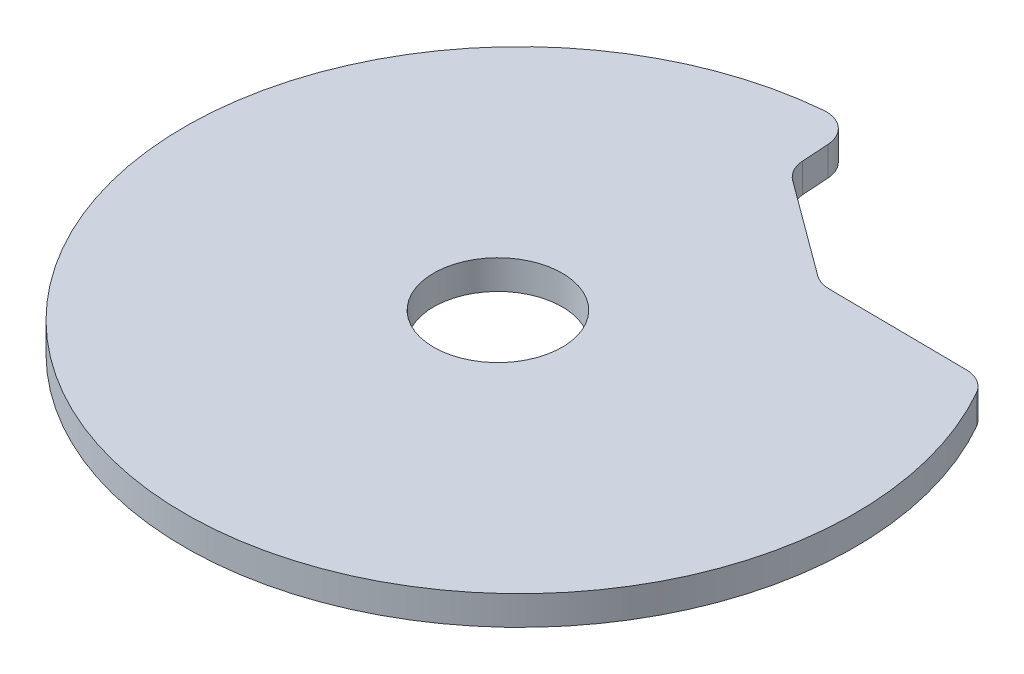
ISO-10303-21;
HEADER;
FILE_DESCRIPTION(('STEP AP214'),'2;1');
FILE_NAME('part.step','',(''),(''),'','','');
FILE_SCHEMA(('AUTOMOTIVE_DESIGN { 1 0 10303 214 1 1 1 1 }'));
ENDSEC;
DATA;
#1=APPLICATION_CONTEXT('core data for automotive mechanical design processes');
#2=APPLICATION_PROTOCOL_DEFINITION('international standard','automotive_design',2000,#1);
#3=PRODUCT_CONTEXT('',#1,'mechanical');
#4=PRODUCT('Part','Part','',(#3));
#5=PRODUCT_RELATED_PRODUCT_CATEGORY('part','',(#4));
#6=PRODUCT_DEFINITION_FORMATION('','',#4);
#7=PRODUCT_DEFINITION_CONTEXT('part definition',#1,'design');
#8=PRODUCT_DEFINITION('design','',#6,#7);
#9=PRODUCT_DEFINITION_SHAPE('','',#8);
#10=(LENGTH_UNIT() NAMED_UNIT(*) SI_UNIT(.MILLI.,.METRE.));
#11=(NAMED_UNIT(*) PLANE_ANGLE_UNIT() SI_UNIT($,.RADIAN.));
#12=(NAMED_UNIT(*) SI_UNIT($,.STERADIAN.) SOLID_ANGLE_UNIT());
#13=UNCERTAINTY_MEASURE_WITH_UNIT(LENGTH_MEASURE(1.E-05),#10,'distance_accuracy_value','');
#14=(GEOMETRIC_REPRESENTATION_CONTEXT(3) GLOBAL_UNCERTAINTY_ASSIGNED_CONTEXT((#13)) GLOBAL_UNIT_ASSIGNED_CONTEXT((#10,
#11,#12)) REPRESENTATION_CONTEXT('',''));
#15=CARTESIAN_POINT('',(0.,0.,0.));
#16=DIRECTION('',(0.,0.,1.));
#17=DIRECTION('',(1.,0.,0.));
#18=AXIS2_PLACEMENT_3D('',#15,#16,#17);
#19=CARTESIAN_POINT('',(110.644760689443,5.,15.7057957737216));
#20=DIRECTION('',(0.,-1.,0.));
#21=DIRECTION('',(0.,0.,-1.));
#22=AXIS2_PLACEMENT_3D('',#19,#20,#21);
#23=CYLINDRICAL_SURFACE('',#22,5.);
#24=CARTESIAN_POINT('',(110.644760689443,0.,15.7057957737216));
#25=DIRECTION('',(0.,1.,0.));
#26=DIRECTION('',(0.,0.,-1.));
#27=AXIS2_PLACEMENT_3D('',#24,#25,#26);
#28=CIRCLE('',#27,5.);
#29=CARTESIAN_POINT('',(114.991586449579,0.,13.2349445416514));
#30=VERTEX_POINT('',#29);
#31=CARTESIAN_POINT('',(110.693591380557,0.,10.7060342230468));
#32=VERTEX_POINT('',#31);
#33=EDGE_CURVE('E127',#30,#32,#28,.T.);
#34=ORIENTED_EDGE('',*,*,#33,.T.);
#35=DIRECTION('',(0.,-1.,0.));
#36=VECTOR('',#35,1.);
#37=CARTESIAN_POINT('',(110.693591380557,5.,10.7060342230468));
#38=LINE('',#37,#36);
#39=CARTESIAN_POINT('',(110.693591380557,5.,10.7060342230468));
#40=VERTEX_POINT('',#39);
#41=EDGE_CURVE('E11',#40,#32,#38,.T.);
#42=ORIENTED_EDGE('',*,*,#41,.F.);
#43=CARTESIAN_POINT('',(110.644760689443,5.,15.7057957737216));
#44=DIRECTION('',(0.,1.,0.));
#45=DIRECTION('',(0.,0.,-1.));
#46=AXIS2_PLACEMENT_3D('',#43,#44,#45);
#47=CIRCLE('',#46,5.);
#48=CARTESIAN_POINT('',(114.991586449579,5.,13.2349445416514));
#49=VERTEX_POINT('',#48);
#50=EDGE_CURVE('E142',#49,#40,#47,.T.);
#51=ORIENTED_EDGE('',*,*,#50,.F.);
#52=DIRECTION('',(0.,-1.,0.));
#53=VECTOR('',#52,1.);
#54=CARTESIAN_POINT('',(114.991586449579,5.,13.2349445416514));
#55=LINE('',#54,#53);
#56=EDGE_CURVE('E123',#49,#30,#55,.T.);
#57=ORIENTED_EDGE('',*,*,#56,.T.);
#58=EDGE_LOOP('',(#34,#42,#51,#57));
#59=FACE_BOUND('',#58,.T.);
#60=ADVANCED_FACE('F31',(#59),#23,.T.);
#61=CARTESIAN_POINT('',(110.693591380557,5.,10.7060342230468));
#62=DIRECTION('',(-0.00976613822282927,0.,0.999952310134945));
#63=DIRECTION('',(0.999952310134945,0.,0.00976613822282927));
#64=AXIS2_PLACEMENT_3D('',#61,#62,#63);
#65=PLANE('',#64);
#66=DIRECTION('',(-0.999952310134945,0.,-0.00976613822282927));
#67=VECTOR('',#66,1.);
#68=CARTESIAN_POINT('',(110.693591380557,0.,10.7060342230468));
#69=LINE('',#68,#67);
#70=CARTESIAN_POINT('',(86.9871071481649,0.,10.4745023795336));
#71=VERTEX_POINT('',#70);
#72=EDGE_CURVE('E130',#32,#71,#69,.T.);
#73=ORIENTED_EDGE('',*,*,#72,.T.);
#74=DIRECTION('',(0.,-1.,0.));
#75=VECTOR('',#74,1.);
#76=CARTESIAN_POINT('',(86.9871071481649,5.,10.4745023795336));
#77=LINE('',#76,#75);
#78=CARTESIAN_POINT('',(86.9871071481649,5.,10.4745023795336));
#79=VERTEX_POINT('',#78);
#80=EDGE_CURVE('E39',#79,#71,#77,.T.);
#81=ORIENTED_EDGE('',*,*,#80,.F.);
#82=DIRECTION('',(-0.999952310134945,0.,-0.00976613822282927));
#83=VECTOR('',#82,1.);
#84=CARTESIAN_POINT('',(110.693591380557,5.,10.7060342230468));
#85=LINE('',#84,#83);
#86=EDGE_CURVE('E90',#40,#79,#85,.T.);
#87=ORIENTED_EDGE('',*,*,#86,.F.);
#88=ORIENTED_EDGE('',*,*,#41,.T.);
#89=EDGE_LOOP('',(#73,#81,#87,#88));
#90=FACE_BOUND('',#89,.T.);
#91=ADVANCED_FACE('F198',(#90),#65,.F.);
#92=CARTESIAN_POINT('',(87.035937839279,5.,5.47474082885887));
#93=DIRECTION('',(0.,-1.,0.));
#94=DIRECTION('',(0.,0.,-1.));
#95=AXIS2_PLACEMENT_3D('',#92,#93,#94);
#96=CYLINDRICAL_SURFACE('',#95,5.);
#97=CARTESIAN_POINT('',(87.035937839279,0.,5.47474082885887));
#98=DIRECTION('',(0.,-1.,0.));
#99=DIRECTION('',(0.,0.,1.));
#100=AXIS2_PLACEMENT_3D('',#97,#98,#99);
#101=CIRCLE('',#100,5.);
#102=CARTESIAN_POINT('',(84.0715766505996,0.,9.50122350522184));
#103=VERTEX_POINT('',#102);
#104=EDGE_CURVE('E133',#71,#103,#101,.T.);
#105=ORIENTED_EDGE('',*,*,#104,.T.);
#106=DIRECTION('',(0.,-1.,0.));
#107=VECTOR('',#106,1.);
#108=CARTESIAN_POINT('',(84.0715766505996,5.,9.50122350522184));
#109=LINE('',#108,#107);
#110=CARTESIAN_POINT('',(84.0715766505996,5.,9.50122350522184));
#111=VERTEX_POINT('',#110);
#112=EDGE_CURVE('E149',#111,#103,#109,.T.);
#113=ORIENTED_EDGE('',*,*,#112,.F.);
#114=CARTESIAN_POINT('',(87.035937839279,5.,5.47474082885887));
#115=DIRECTION('',(0.,-1.,0.));
#116=DIRECTION('',(0.,0.,1.));
#117=AXIS2_PLACEMENT_3D('',#114,#115,#116);
#118=CIRCLE('',#117,5.);
#119=EDGE_CURVE('E157',#79,#111,#118,.T.);
#120=ORIENTED_EDGE('',*,*,#119,.F.);
#121=ORIENTED_EDGE('',*,*,#80,.T.);
#122=EDGE_LOOP('',(#105,#113,#120,#121));
#123=FACE_BOUND('',#122,.T.);
#124=ADVANCED_FACE('F155',(#123),#96,.F.);
#125=CARTESIAN_POINT('',(84.0715766505996,5.,9.50122350522184));
#126=DIRECTION('',(-0.592872237735882,0.,0.805296535272596));
#127=DIRECTION('',(0.805296535272596,0.,0.592872237735882));
#128=AXIS2_PLACEMENT_3D('',#125,#126,#127);
#129=PLANE('',#128);
#130=DIRECTION('',(-0.805296535272596,0.,-0.592872237735882));
#131=VECTOR('',#130,1.);
#132=CARTESIAN_POINT('',(84.0715766505996,0.,9.50122350522184));
#133=LINE('',#132,#131);
#134=CARTESIAN_POINT('',(67.7730019937291,0.,-2.498048819293));
#135=VERTEX_POINT('',#134);
#136=EDGE_CURVE('E135',#103,#135,#133,.T.);
#137=ORIENTED_EDGE('',*,*,#136,.T.);
#138=DIRECTION('',(0.,-1.,0.));
#139=VECTOR('',#138,1.);
#140=CARTESIAN_POINT('',(67.7730019937291,5.,-2.498048819293));
#141=LINE('',#140,#139);
#142=CARTESIAN_POINT('',(67.7730019937291,5.,-2.498048819293));
#143=VERTEX_POINT('',#142);
#144=EDGE_CURVE('E146',#143,#135,#141,.T.);
#145=ORIENTED_EDGE('',*,*,#144,.F.);
#146=DIRECTION('',(-0.805296535272596,0.,-0.592872237735882));
#147=VECTOR('',#146,1.);
#148=CARTESIAN_POINT('',(84.0715766505996,5.,9.50122350522184));
#149=LINE('',#148,#147);
#150=EDGE_CURVE('E169',#111,#143,#149,.T.);
#151=ORIENTED_EDGE('',*,*,#150,.F.);
#152=ORIENTED_EDGE('',*,*,#112,.T.);
#153=EDGE_LOOP('',(#137,#145,#151,#152));
#154=FACE_BOUND('',#153,.T.);
#155=ADVANCED_FACE('F165',(#154),#129,.F.);
#156=CARTESIAN_POINT('',(70.7373631824085,5.,-6.52453149565599));
#157=DIRECTION('',(0.,-1.,0.));
#158=DIRECTION('',(0.,0.,-1.));
#159=AXIS2_PLACEMENT_3D('',#156,#157,#158);
#160=CYLINDRICAL_SURFACE('',#159,5.00000000000001);
#161=CARTESIAN_POINT('',(70.7373631824085,0.,-6.52453149565599));
#162=DIRECTION('',(0.,-1.,0.));
#163=DIRECTION('',(0.,0.,1.));
#164=AXIS2_PLACEMENT_3D('',#161,#162,#163);
#165=CIRCLE('',#164,5.00000000000001);
#166=CARTESIAN_POINT('',(65.7479465901804,0.,-6.19938219272063));
#167=VERTEX_POINT('',#166);
#168=EDGE_CURVE('E137',#135,#167,#165,.T.);
#169=ORIENTED_EDGE('',*,*,#168,.T.);
#170=DIRECTION('',(0.,-1.,0.));
#171=VECTOR('',#170,1.);
#172=CARTESIAN_POINT('',(65.7479465901804,5.,-6.19938219272063));
#173=LINE('',#172,#171);
#174=CARTESIAN_POINT('',(65.7479465901804,5.,-6.19938219272063));
#175=VERTEX_POINT('',#174);
#176=EDGE_CURVE('E118',#175,#167,#173,.T.);
#177=ORIENTED_EDGE('',*,*,#176,.F.);
#178=CARTESIAN_POINT('',(70.7373631824085,5.,-6.52453149565599));
#179=DIRECTION('',(0.,-1.,0.));
#180=DIRECTION('',(0.,0.,1.));
#181=AXIS2_PLACEMENT_3D('',#178,#179,#180);
#182=CIRCLE('',#181,5.00000000000001);
#183=EDGE_CURVE('E109',#143,#175,#182,.T.);
#184=ORIENTED_EDGE('',*,*,#183,.F.);
#185=ORIENTED_EDGE('',*,*,#144,.T.);
#186=EDGE_LOOP('',(#169,#177,#184,#185));
#187=FACE_BOUND('',#186,.T.);
#188=ADVANCED_FACE('F168',(#187),#160,.F.);
#189=CARTESIAN_POINT('',(65.7479465901804,5.,-6.19938219272063));
#190=DIRECTION('',(-0.997883318445611,0.,0.0650298605870759));
#191=DIRECTION('',(0.065029860587076,0.,0.997883318445612));
#192=AXIS2_PLACEMENT_3D('',#189,#190,#191);
#193=PLANE('',#192);
#194=DIRECTION('',(-0.0650298605870759,0.,-0.997883318445611));
#195=VECTOR('',#194,1.);
#196=CARTESIAN_POINT('',(65.7479465901804,0.,-6.19938219272063));
#197=LINE('',#196,#195);
#198=CARTESIAN_POINT('',(65.4418436986623,0.,-10.8965315701964));
#199=VERTEX_POINT('',#198);
#200=EDGE_CURVE('E117',#167,#199,#197,.T.);
#201=ORIENTED_EDGE('',*,*,#200,.T.);
#202=DIRECTION('',(0.,-1.,0.));
#203=VECTOR('',#202,1.);
#204=CARTESIAN_POINT('',(65.4418436986623,5.,-10.8965315701964));
#205=LINE('',#204,#203);
#206=CARTESIAN_POINT('',(65.4418436986623,5.,-10.8965315701964));
#207=VERTEX_POINT('',#206);
#208=EDGE_CURVE('E114',#207,#199,#205,.T.);
#209=ORIENTED_EDGE('',*,*,#208,.F.);
#210=DIRECTION('',(-0.0650298605870759,0.,-0.997883318445611));
#211=VECTOR('',#210,1.);
#212=CARTESIAN_POINT('',(65.7479465901804,5.,-6.19938219272063));
#213=LINE('',#212,#211);
#214=EDGE_CURVE('E103',#175,#207,#213,.T.);
#215=ORIENTED_EDGE('',*,*,#214,.F.);
#216=ORIENTED_EDGE('',*,*,#176,.T.);
#217=EDGE_LOOP('',(#201,#209,#215,#216));
#218=FACE_BOUND('',#217,.T.);
#219=ADVANCED_FACE('F115',(#218),#193,.F.);
#220=CARTESIAN_POINT('',(60.4524271064342,5.,-10.571382267261));
#221=DIRECTION('',(0.,-1.,0.));
#222=DIRECTION('',(0.,0.,-1.));
#223=AXIS2_PLACEMENT_3D('',#220,#221,#222);
#224=CYLINDRICAL_SURFACE('',#223,5.);
#225=CARTESIAN_POINT('',(60.4524271064342,0.,-10.571382267261));
#226=DIRECTION('',(0.,1.,0.));
#227=DIRECTION('',(0.,0.,-1.));
#228=AXIS2_PLACEMENT_3D('',#225,#226,#227);
#229=CIRCLE('',#228,5.);
#230=CARTESIAN_POINT('',(60.0063769619841,0.,-15.5514464504454));
#231=VERTEX_POINT('',#230);
#232=EDGE_CURVE('E76',#199,#231,#229,.T.);
#233=ORIENTED_EDGE('',*,*,#232,.T.);
#234=DIRECTION('',(0.,-1.,0.));
#235=VECTOR('',#234,1.);
#236=CARTESIAN_POINT('',(60.0063769619841,5.,-15.5514464504454));
#237=LINE('',#236,#235);
#238=CARTESIAN_POINT('',(60.0063769619841,5.,-15.5514464504454));
#239=VERTEX_POINT('',#238);
#240=EDGE_CURVE('E119',#239,#231,#237,.T.);
#241=ORIENTED_EDGE('',*,*,#240,.F.);
#242=CARTESIAN_POINT('',(60.4524271064342,5.,-10.571382267261));
#243=DIRECTION('',(0.,1.,0.));
#244=DIRECTION('',(0.,0.,-1.));
#245=AXIS2_PLACEMENT_3D('',#242,#243,#244);
#246=CIRCLE('',#245,5.);
#247=EDGE_CURVE('E107',#207,#239,#246,.T.);
#248=ORIENTED_EDGE('',*,*,#247,.F.);
#249=ORIENTED_EDGE('',*,*,#208,.T.);
#250=EDGE_LOOP('',(#233,#241,#248,#249));
#251=FACE_BOUND('',#250,.T.);
#252=ADVANCED_FACE('F121',(#251),#224,.T.);
#253=CARTESIAN_POINT('',(65.123588657596,5.,41.5812391907737));
#254=DIRECTION('',(0.,-1.,0.));
#255=DIRECTION('',(0.,0.,-1.));
#256=AXIS2_PLACEMENT_3D('',#253,#254,#255);
#257=CYLINDRICAL_SURFACE('',#256,57.3613948933955);
#258=CARTESIAN_POINT('',(65.123588657596,0.,41.5812391907737));
#259=DIRECTION('',(0.,1.,0.));
#260=DIRECTION('',(0.,0.,1.));
#261=AXIS2_PLACEMENT_3D('',#258,#259,#260);
#262=CIRCLE('',#261,57.3613948933955);
#263=EDGE_CURVE('E82',#231,#30,#262,.T.);
#264=ORIENTED_EDGE('',*,*,#263,.T.);
#265=ORIENTED_EDGE('',*,*,#56,.F.);
#266=CARTESIAN_POINT('',(65.123588657596,5.,41.5812391907737));
#267=DIRECTION('',(0.,1.,0.));
#268=DIRECTION('',(0.,0.,1.));
#269=AXIS2_PLACEMENT_3D('',#266,#267,#268);
#270=CIRCLE('',#269,57.3613948933955);
#271=EDGE_CURVE('E47',#239,#49,#270,.T.);
#272=ORIENTED_EDGE('',*,*,#271,.F.);
#273=ORIENTED_EDGE('',*,*,#240,.T.);
#274=EDGE_LOOP('',(#264,#265,#272,#273));
#275=FACE_BOUND('',#274,.T.);
#276=ADVANCED_FACE('F189',(#275),#257,.T.);
#277=CARTESIAN_POINT('',(110.644760689443,5.,15.7057957737216));
#278=DIRECTION('',(0.,-1.,0.));
#279=DIRECTION('',(0.,0.,-1.));
#280=AXIS2_PLACEMENT_3D('',#277,#278,#279);
#281=PLANE('',#280);
#282=CARTESIAN_POINT('',(61.7724665667284,5.,41.9718634744276));
#283=DIRECTION('',(0.,1.,0.));
#284=DIRECTION('',(0.,0.,1.));
#285=AXIS2_PLACEMENT_3D('',#282,#283,#284);
#286=CIRCLE('',#285,11.);
#287=CARTESIAN_POINT('',(61.7724665667284,5.,52.9718634744276));
#288=VERTEX_POINT('',#287);
#289=EDGE_CURVE('E175',#288,#288,#286,.T.);
#290=ORIENTED_EDGE('',*,*,#289,.F.);
#291=EDGE_LOOP('',(#290));
#292=FACE_BOUND('',#291,.T.);
#293=ORIENTED_EDGE('',*,*,#50,.T.);
#294=ORIENTED_EDGE('',*,*,#86,.T.);
#295=ORIENTED_EDGE('',*,*,#119,.T.);
#296=ORIENTED_EDGE('',*,*,#150,.T.);
#297=ORIENTED_EDGE('',*,*,#183,.T.);
#298=ORIENTED_EDGE('',*,*,#214,.T.);
#299=ORIENTED_EDGE('',*,*,#247,.T.);
#300=ORIENTED_EDGE('',*,*,#271,.T.);
#301=EDGE_LOOP('',(#293,#294,#295,#296,#297,#298,#299,#300));
#302=FACE_BOUND('',#301,.T.);
#303=ADVANCED_FACE('F105',(#292,#302),#281,.F.);
#304=CARTESIAN_POINT('',(110.644760689443,0.,15.7057957737216));
#305=DIRECTION('',(0.,-1.,0.));
#306=DIRECTION('',(0.,0.,-1.));
#307=AXIS2_PLACEMENT_3D('',#304,#305,#306);
#308=PLANE('',#307);
#309=CARTESIAN_POINT('',(61.7724665667284,0.,41.9718634744276));
#310=DIRECTION('',(0.,1.,0.));
#311=DIRECTION('',(0.,0.,1.));
#312=AXIS2_PLACEMENT_3D('',#309,#310,#311);
#313=CIRCLE('',#312,11.);
#314=CARTESIAN_POINT('',(61.7724665667284,0.,52.9718634744276));
#315=VERTEX_POINT('',#314);
#316=EDGE_CURVE('E131',#315,#315,#313,.T.);
#317=ORIENTED_EDGE('',*,*,#316,.T.);
#318=EDGE_LOOP('',(#317));
#319=FACE_BOUND('',#318,.T.);
#320=ORIENTED_EDGE('',*,*,#33,.F.);
#321=ORIENTED_EDGE('',*,*,#263,.F.);
#322=ORIENTED_EDGE('',*,*,#232,.F.);
#323=ORIENTED_EDGE('',*,*,#200,.F.);
#324=ORIENTED_EDGE('',*,*,#168,.F.);
#325=ORIENTED_EDGE('',*,*,#136,.F.);
#326=ORIENTED_EDGE('',*,*,#104,.F.);
#327=ORIENTED_EDGE('',*,*,#72,.F.);
#328=EDGE_LOOP('',(#320,#321,#322,#323,#324,#325,#326,#327));
#329=FACE_BOUND('',#328,.T.);
#330=ADVANCED_FACE('F161',(#319,#329),#308,.T.);
#331=CARTESIAN_POINT('',(61.7724665667284,0.,41.9718634744276));
#332=DIRECTION('',(0.,1.,0.));
#333=DIRECTION('',(0.,0.,1.));
#334=AXIS2_PLACEMENT_3D('',#331,#332,#333);
#335=CYLINDRICAL_SURFACE('',#334,11.);
#336=ORIENTED_EDGE('',*,*,#316,.F.);
#337=EDGE_LOOP('',(#336));
#338=FACE_BOUND('',#337,.T.);
#339=ORIENTED_EDGE('',*,*,#289,.T.);
#340=EDGE_LOOP('',(#339));
#341=FACE_BOUND('',#340,.T.);
#342=ADVANCED_FACE('F182',(#338,#341),#335,.F.);
#343=CLOSED_SHELL('',(#60,#91,#124,#155,#188,#219,#252,#276,#303,#330,#342));
#344=MANIFOLD_SOLID_BREP('B2',#343);
#345=ADVANCED_BREP_SHAPE_REPRESENTATION('',(#18,#344),#14);
#346=SHAPE_DEFINITION_REPRESENTATION(#9,#345);
ENDSEC;
END-ISO-10303-21;
